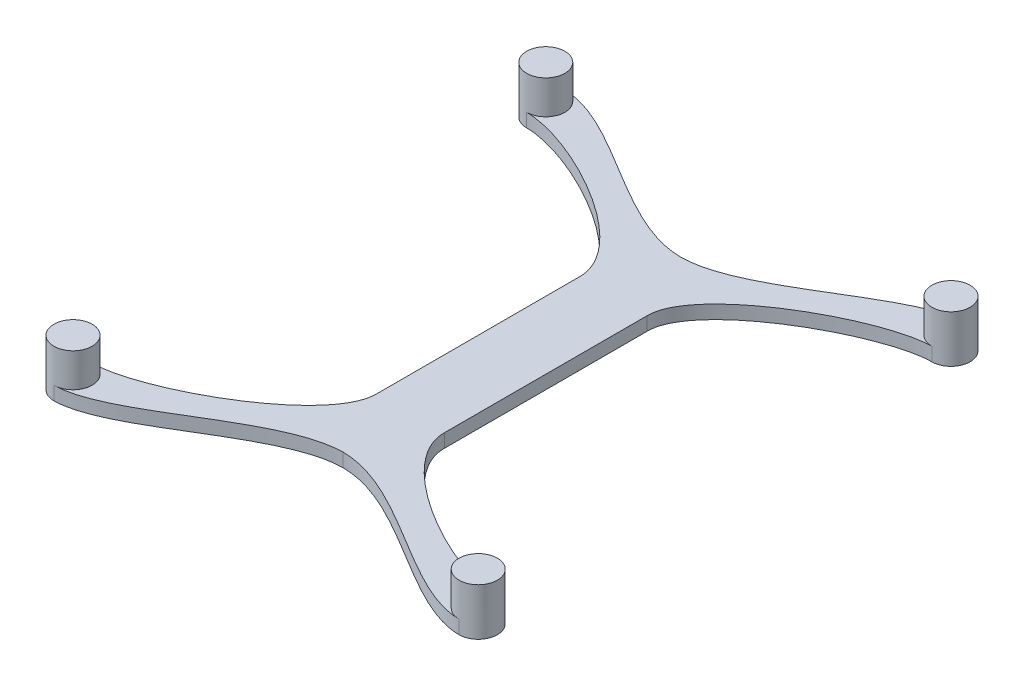
ISO-10303-21;
HEADER;
FILE_DESCRIPTION(('STEP AP214'),'2;1');
FILE_NAME('part.step','',(''),(''),'','','');
FILE_SCHEMA(('AUTOMOTIVE_DESIGN { 1 0 10303 214 1 1 1 1 }'));
ENDSEC;
DATA;
#1=APPLICATION_CONTEXT('core data for automotive mechanical design processes');
#2=APPLICATION_PROTOCOL_DEFINITION('international standard','automotive_design',2000,#1);
#3=PRODUCT_CONTEXT('',#1,'mechanical');
#4=PRODUCT('Part','Part','',(#3));
#5=PRODUCT_RELATED_PRODUCT_CATEGORY('part','',(#4));
#6=PRODUCT_DEFINITION_FORMATION('','',#4);
#7=PRODUCT_DEFINITION_CONTEXT('part definition',#1,'design');
#8=PRODUCT_DEFINITION('design','',#6,#7);
#9=PRODUCT_DEFINITION_SHAPE('','',#8);
#10=(LENGTH_UNIT() NAMED_UNIT(*) SI_UNIT(.MILLI.,.METRE.));
#11=(NAMED_UNIT(*) PLANE_ANGLE_UNIT() SI_UNIT($,.RADIAN.));
#12=(NAMED_UNIT(*) SI_UNIT($,.STERADIAN.) SOLID_ANGLE_UNIT());
#13=UNCERTAINTY_MEASURE_WITH_UNIT(LENGTH_MEASURE(1.E-05),#10,'distance_accuracy_value','');
#14=(GEOMETRIC_REPRESENTATION_CONTEXT(3) GLOBAL_UNCERTAINTY_ASSIGNED_CONTEXT((#13)) GLOBAL_UNIT_ASSIGNED_CONTEXT((#10,
#11,#12)) REPRESENTATION_CONTEXT('',''));
#15=CARTESIAN_POINT('',(0.,0.,0.));
#16=DIRECTION('',(0.,0.,1.));
#17=DIRECTION('',(1.,0.,0.));
#18=AXIS2_PLACEMENT_3D('',#15,#16,#17);
#19=CARTESIAN_POINT('',(0.,2.54,0.));
#20=DIRECTION('',(0.,1.,0.));
#21=DIRECTION('',(0.,0.,1.));
#22=AXIS2_PLACEMENT_3D('',#19,#20,#21);
#23=PLANE('',#22);
#24=CARTESIAN_POINT('',(0.,2.54,31.75));
#25=CARTESIAN_POINT('',(11.9435219789802,2.54,31.8273533169688));
#26=CARTESIAN_POINT('',(27.7064298825426,2.54,47.9601152899071));
#27=CARTESIAN_POINT('',(38.1,2.54,48.0441));
#28=B_SPLINE_CURVE_WITH_KNOTS('',3,(#24,#25,#26,#27),.UNSPECIFIED.,.F.,.F.,(4,4),(0.,1.),.UNSPECIFIED.);
#29=CARTESIAN_POINT('',(0.,2.54,31.75));
#30=VERTEX_POINT('',#29);
#31=CARTESIAN_POINT('',(38.0102091373793,2.54,48.0429782090864));
#32=VERTEX_POINT('',#31);
#33=EDGE_CURVE('E174',#30,#32,#28,.T.);
#34=ORIENTED_EDGE('',*,*,#33,.T.);
#35=CARTESIAN_POINT('',(38.1,2.54,44.45));
#36=DIRECTION('',(0.,1.,0.));
#37=DIRECTION('',(0.,0.,-1.));
#38=AXIS2_PLACEMENT_3D('',#35,#36,#37);
#39=CIRCLE('',#38,3.5941);
#40=CARTESIAN_POINT('',(38.1,2.54,40.8559));
#41=VERTEX_POINT('',#40);
#42=EDGE_CURVE('E181',#41,#32,#39,.T.);
#43=ORIENTED_EDGE('',*,*,#42,.F.);
#44=CARTESIAN_POINT('',(6.35,2.54,19.05));
#45=CARTESIAN_POINT('',(6.17525079711161,2.54,28.3940371659148));
#46=CARTESIAN_POINT('',(28.7527001791665,2.54,40.7931123845633));
#47=CARTESIAN_POINT('',(38.1,2.54,40.8559));
#48=B_SPLINE_CURVE_WITH_KNOTS('',3,(#44,#45,#46,#47),.UNSPECIFIED.,.F.,.F.,(4,4),(0.,1.),.UNSPECIFIED.);
#49=CARTESIAN_POINT('',(6.35,2.54,19.05));
#50=VERTEX_POINT('',#49);
#51=EDGE_CURVE('E163',#50,#41,#48,.T.);
#52=ORIENTED_EDGE('',*,*,#51,.F.);
#53=DIRECTION('',(0.,0.,-1.));
#54=VECTOR('',#53,1.);
#55=CARTESIAN_POINT('',(6.35,2.54,0.));
#56=LINE('',#55,#54);
#57=CARTESIAN_POINT('',(6.35,2.54,-19.05));
#58=VERTEX_POINT('',#57);
#59=EDGE_CURVE('E259',#50,#58,#56,.T.);
#60=ORIENTED_EDGE('',*,*,#59,.T.);
#61=CARTESIAN_POINT('',(6.35,2.54,-19.05));
#62=CARTESIAN_POINT('',(6.17525079711161,2.54,-28.3940371659148));
#63=CARTESIAN_POINT('',(28.7527001791665,2.54,-40.7931123845633));
#64=CARTESIAN_POINT('',(38.1,2.54,-40.8559));
#65=B_SPLINE_CURVE_WITH_KNOTS('',3,(#61,#62,#63,#64),.UNSPECIFIED.,.F.,.F.,(4,4),(0.,1.),.UNSPECIFIED.);
#66=CARTESIAN_POINT('',(38.1,2.54,-40.8559));
#67=VERTEX_POINT('',#66);
#68=EDGE_CURVE('E254',#58,#67,#65,.T.);
#69=ORIENTED_EDGE('',*,*,#68,.T.);
#70=CARTESIAN_POINT('',(38.1,2.54,-44.45));
#71=DIRECTION('',(0.,-1.,0.));
#72=DIRECTION('',(0.,0.,1.));
#73=AXIS2_PLACEMENT_3D('',#70,#71,#72);
#74=CIRCLE('',#73,3.5941);
#75=CARTESIAN_POINT('',(38.0102091373792,2.54,-48.0429782090892));
#76=VERTEX_POINT('',#75);
#77=EDGE_CURVE('E203',#67,#76,#74,.T.);
#78=ORIENTED_EDGE('',*,*,#77,.T.);
#79=CARTESIAN_POINT('',(0.,2.54,-31.75));
#80=CARTESIAN_POINT('',(11.9435219789802,2.54,-31.8273533169688));
#81=CARTESIAN_POINT('',(27.7064298825426,2.54,-47.9601152899071));
#82=CARTESIAN_POINT('',(38.1,2.54,-48.0441));
#83=B_SPLINE_CURVE_WITH_KNOTS('',3,(#79,#80,#81,#82),.UNSPECIFIED.,.F.,.F.,(4,4),(0.,1.),.UNSPECIFIED.);
#84=CARTESIAN_POINT('',(0.,2.54,-31.75));
#85=VERTEX_POINT('',#84);
#86=EDGE_CURVE('E266',#85,#76,#83,.T.);
#87=ORIENTED_EDGE('',*,*,#86,.F.);
#88=CARTESIAN_POINT('',(0.,2.54,-31.75));
#89=CARTESIAN_POINT('',(-11.9435219789802,2.54,-31.8273533169688));
#90=CARTESIAN_POINT('',(-27.7064298825426,2.54,-47.9601152899071));
#91=CARTESIAN_POINT('',(-38.1,2.54,-48.0441));
#92=B_SPLINE_CURVE_WITH_KNOTS('',3,(#88,#89,#90,#91),.UNSPECIFIED.,.F.,.F.,(4,4),(0.,1.),.UNSPECIFIED.);
#93=CARTESIAN_POINT('',(-38.0102091373793,2.54,-48.0429782090864));
#94=VERTEX_POINT('',#93);
#95=EDGE_CURVE('E402',#85,#94,#92,.T.);
#96=ORIENTED_EDGE('',*,*,#95,.T.);
#97=CARTESIAN_POINT('',(-38.1,2.54,-44.45));
#98=DIRECTION('',(0.,1.,0.));
#99=DIRECTION('',(0.,0.,1.));
#100=AXIS2_PLACEMENT_3D('',#97,#98,#99);
#101=CIRCLE('',#100,3.5941);
#102=CARTESIAN_POINT('',(-38.1,2.54,-40.8559));
#103=VERTEX_POINT('',#102);
#104=EDGE_CURVE('E371',#103,#94,#101,.T.);
#105=ORIENTED_EDGE('',*,*,#104,.F.);
#106=CARTESIAN_POINT('',(-6.35,2.54,-19.05));
#107=CARTESIAN_POINT('',(-6.17525079711161,2.54,-28.3940371659148));
#108=CARTESIAN_POINT('',(-28.7527001791665,2.54,-40.7931123845633));
#109=CARTESIAN_POINT('',(-38.1,2.54,-40.8559));
#110=B_SPLINE_CURVE_WITH_KNOTS('',3,(#106,#107,#108,#109),.UNSPECIFIED.,.F.,.F.,(4,4),(0.,1.),.UNSPECIFIED.);
#111=CARTESIAN_POINT('',(-6.35,2.54,-19.05));
#112=VERTEX_POINT('',#111);
#113=EDGE_CURVE('E394',#112,#103,#110,.T.);
#114=ORIENTED_EDGE('',*,*,#113,.F.);
#115=DIRECTION('',(0.,0.,-1.));
#116=VECTOR('',#115,1.);
#117=CARTESIAN_POINT('',(-6.35,2.54,0.));
#118=LINE('',#117,#116);
#119=CARTESIAN_POINT('',(-6.35,2.54,19.05));
#120=VERTEX_POINT('',#119);
#121=EDGE_CURVE('E397',#120,#112,#118,.T.);
#122=ORIENTED_EDGE('',*,*,#121,.F.);
#123=CARTESIAN_POINT('',(-6.35,2.54,19.05));
#124=CARTESIAN_POINT('',(-6.17525079711161,2.54,28.3940371659148));
#125=CARTESIAN_POINT('',(-28.7527001791665,2.54,40.7931123845633));
#126=CARTESIAN_POINT('',(-38.1,2.54,40.8559));
#127=B_SPLINE_CURVE_WITH_KNOTS('',3,(#123,#124,#125,#126),.UNSPECIFIED.,.F.,.F.,(4,4),(0.,1.),.UNSPECIFIED.);
#128=CARTESIAN_POINT('',(-38.1,2.54,40.8559));
#129=VERTEX_POINT('',#128);
#130=EDGE_CURVE('E348',#120,#129,#127,.T.);
#131=ORIENTED_EDGE('',*,*,#130,.T.);
#132=CARTESIAN_POINT('',(-38.1,2.54,44.45));
#133=DIRECTION('',(0.,-1.,0.));
#134=DIRECTION('',(0.,0.,-1.));
#135=AXIS2_PLACEMENT_3D('',#132,#133,#134);
#136=CIRCLE('',#135,3.5941);
#137=CARTESIAN_POINT('',(-38.0102091373792,2.54,48.0429782090892));
#138=VERTEX_POINT('',#137);
#139=EDGE_CURVE('E202',#129,#138,#136,.T.);
#140=ORIENTED_EDGE('',*,*,#139,.T.);
#141=CARTESIAN_POINT('',(0.,2.54,31.75));
#142=CARTESIAN_POINT('',(-11.9435219789802,2.54,31.8273533169688));
#143=CARTESIAN_POINT('',(-27.7064298825426,2.54,47.9601152899071));
#144=CARTESIAN_POINT('',(-38.1,2.54,48.0441));
#145=B_SPLINE_CURVE_WITH_KNOTS('',3,(#141,#142,#143,#144),.UNSPECIFIED.,.F.,.F.,(4,4),(0.,1.),.UNSPECIFIED.);
#146=EDGE_CURVE('E355',#30,#138,#145,.T.);
#147=ORIENTED_EDGE('',*,*,#146,.F.);
#148=EDGE_LOOP('',(#34,#43,#52,#60,#69,#78,#87,#96,#105,#114,#122,#131,#140,#147));
#149=FACE_BOUND('',#148,.T.);
#150=ADVANCED_FACE('F43',(#149),#23,.T.);
#151=DIRECTION('',(0.,-1.,0.));
#152=VECTOR('',#151,1.);
#153=SURFACE_OF_LINEAR_EXTRUSION('',#110,#152);
#154=CARTESIAN_POINT('',(-6.35,0.,-19.05));
#155=CARTESIAN_POINT('',(-6.17525079711161,0.,-28.3940371659148));
#156=CARTESIAN_POINT('',(-28.7527001791665,0.,-40.7931123845633));
#157=CARTESIAN_POINT('',(-38.1,0.,-40.8559));
#158=B_SPLINE_CURVE_WITH_KNOTS('',3,(#154,#155,#156,#157),.UNSPECIFIED.,.F.,.F.,(4,4),(0.,1.),.UNSPECIFIED.);
#159=CARTESIAN_POINT('',(-6.35,0.,-19.05));
#160=VERTEX_POINT('',#159);
#161=CARTESIAN_POINT('',(-38.1,0.,-40.8559));
#162=VERTEX_POINT('',#161);
#163=EDGE_CURVE('E379',#160,#162,#158,.T.);
#164=ORIENTED_EDGE('',*,*,#163,.F.);
#165=DIRECTION('',(0.,-1.,0.));
#166=VECTOR('',#165,1.);
#167=CARTESIAN_POINT('',(-6.35,2.54,-19.05));
#168=LINE('',#167,#166);
#169=EDGE_CURVE('E11',#112,#160,#168,.T.);
#170=ORIENTED_EDGE('',*,*,#169,.F.);
#171=ORIENTED_EDGE('',*,*,#113,.T.);
#172=DIRECTION('',(0.,-1.,0.));
#173=VECTOR('',#172,1.);
#174=CARTESIAN_POINT('',(-38.1,2.54,-40.8559));
#175=LINE('',#174,#173);
#176=EDGE_CURVE('E404',#103,#162,#175,.T.);
#177=ORIENTED_EDGE('',*,*,#176,.T.);
#178=EDGE_LOOP('',(#164,#170,#171,#177));
#179=FACE_BOUND('',#178,.T.);
#180=ADVANCED_FACE('F45',(#179),#153,.T.);
#181=CARTESIAN_POINT('',(-6.35,2.54,0.));
#182=DIRECTION('',(-1.,0.,0.));
#183=DIRECTION('',(0.,0.,1.));
#184=AXIS2_PLACEMENT_3D('',#181,#182,#183);
#185=PLANE('',#184);
#186=DIRECTION('',(0.,0.,-1.));
#187=VECTOR('',#186,1.);
#188=CARTESIAN_POINT('',(-6.35,0.,0.));
#189=LINE('',#188,#187);
#190=CARTESIAN_POINT('',(-6.35,0.,19.05));
#191=VERTEX_POINT('',#190);
#192=EDGE_CURVE('E383',#191,#160,#189,.T.);
#193=ORIENTED_EDGE('',*,*,#192,.F.);
#194=DIRECTION('',(0.,-1.,0.));
#195=VECTOR('',#194,1.);
#196=CARTESIAN_POINT('',(-6.35,2.54,19.05));
#197=LINE('',#196,#195);
#198=EDGE_CURVE('E358',#120,#191,#197,.T.);
#199=ORIENTED_EDGE('',*,*,#198,.F.);
#200=ORIENTED_EDGE('',*,*,#121,.T.);
#201=ORIENTED_EDGE('',*,*,#169,.T.);
#202=EDGE_LOOP('',(#193,#199,#200,#201));
#203=FACE_BOUND('',#202,.T.);
#204=ADVANCED_FACE('F531',(#203),#185,.T.);
#205=DIRECTION('',(0.,-1.,0.));
#206=VECTOR('',#205,1.);
#207=SURFACE_OF_LINEAR_EXTRUSION('',#92,#206);
#208=CARTESIAN_POINT('',(0.,0.,-31.75));
#209=CARTESIAN_POINT('',(-11.9435219789802,0.,-31.8273533169688));
#210=CARTESIAN_POINT('',(-27.7064298825426,0.,-47.9601152899071));
#211=CARTESIAN_POINT('',(-38.1,0.,-48.0441));
#212=B_SPLINE_CURVE_WITH_KNOTS('',3,(#208,#209,#210,#211),.UNSPECIFIED.,.F.,.F.,(4,4),(0.,1.),.UNSPECIFIED.);
#213=CARTESIAN_POINT('',(0.,0.,-31.75));
#214=VERTEX_POINT('',#213);
#215=CARTESIAN_POINT('',(-38.1,0.,-48.0441));
#216=VERTEX_POINT('',#215);
#217=EDGE_CURVE('E387',#214,#216,#212,.T.);
#218=ORIENTED_EDGE('',*,*,#217,.T.);
#219=DIRECTION('',(0.,-1.,0.));
#220=VECTOR('',#219,1.);
#221=CARTESIAN_POINT('',(-38.1,2.54,-48.0441));
#222=LINE('',#221,#220);
#223=CARTESIAN_POINT('',(-38.1,2.54,-48.0441));
#224=VERTEX_POINT('',#223);
#225=EDGE_CURVE('E407',#224,#216,#222,.T.);
#226=ORIENTED_EDGE('',*,*,#225,.F.);
#227=CARTESIAN_POINT('',(-38.1,2.54,-48.0441));
#228=CARTESIAN_POINT('',(-38.0701140337997,2.54,-48.0438585079834));
#229=CARTESIAN_POINT('',(-38.040183673441,2.54,-48.0434843232607));
#230=CARTESIAN_POINT('',(-38.0102091373793,2.54,-48.0429782090864));
#231=B_SPLINE_CURVE_WITH_KNOTS('',3,(#227,#228,#229,#230),.UNSPECIFIED.,.F.,.F.,(4,4),
(0.99712457164742,1.),.UNSPECIFIED.);
#232=EDGE_CURVE('E73',#94,#224,#231,.F.);
#233=ORIENTED_EDGE('',*,*,#232,.F.);
#234=ORIENTED_EDGE('',*,*,#95,.F.);
#235=DIRECTION('',(0.,-1.,0.));
#236=VECTOR('',#235,1.);
#237=CARTESIAN_POINT('',(0.,2.54,-31.75));
#238=LINE('',#237,#236);
#239=EDGE_CURVE('E56',#85,#214,#238,.T.);
#240=ORIENTED_EDGE('',*,*,#239,.T.);
#241=EDGE_LOOP('',(#218,#226,#233,#234,#240));
#242=FACE_BOUND('',#241,.T.);
#243=ADVANCED_FACE('F435',(#242),#207,.F.);
#244=CARTESIAN_POINT('',(-38.1,2.54,-44.45));
#245=DIRECTION('',(0.,-1.,0.));
#246=DIRECTION('',(0.,0.,-1.));
#247=AXIS2_PLACEMENT_3D('',#244,#245,#246);
#248=CYLINDRICAL_SURFACE('',#247,3.5941);
#249=CARTESIAN_POINT('',(-38.1,0.,-44.45));
#250=DIRECTION('',(0.,1.,0.));
#251=DIRECTION('',(0.,0.,1.));
#252=AXIS2_PLACEMENT_3D('',#249,#250,#251);
#253=CIRCLE('',#252,3.5941);
#254=EDGE_CURVE('E390',#216,#162,#253,.T.);
#255=ORIENTED_EDGE('',*,*,#254,.T.);
#256=ORIENTED_EDGE('',*,*,#176,.F.);
#257=ORIENTED_EDGE('',*,*,#104,.T.);
#258=ORIENTED_EDGE('',*,*,#232,.T.);
#259=ORIENTED_EDGE('',*,*,#225,.T.);
#260=EDGE_LOOP('',(#255,#256,#257,#258,#259));
#261=FACE_BOUND('',#260,.T.);
#262=CARTESIAN_POINT('',(-38.1,8.89,-44.45));
#263=DIRECTION('',(0.,1.,0.));
#264=DIRECTION('',(0.,0.,1.));
#265=AXIS2_PLACEMENT_3D('',#262,#263,#264);
#266=CIRCLE('',#265,3.5941);
#267=CARTESIAN_POINT('',(-38.1,8.89,-40.8559));
#268=VERTEX_POINT('',#267);
#269=EDGE_CURVE('E375',#268,#268,#266,.T.);
#270=ORIENTED_EDGE('',*,*,#269,.F.);
#271=EDGE_LOOP('',(#270));
#272=FACE_BOUND('',#271,.T.);
#273=ADVANCED_FACE('F449',(#261,#272),#248,.T.);
#274=CARTESIAN_POINT('',(0.,0.,0.));
#275=DIRECTION('',(0.,1.,0.));
#276=DIRECTION('',(0.,0.,1.));
#277=AXIS2_PLACEMENT_3D('',#274,#275,#276);
#278=PLANE('',#277);
#279=ORIENTED_EDGE('',*,*,#163,.T.);
#280=ORIENTED_EDGE('',*,*,#254,.F.);
#281=ORIENTED_EDGE('',*,*,#217,.F.);
#282=CARTESIAN_POINT('',(0.,0.,-31.75));
#283=CARTESIAN_POINT('',(11.9435219789802,0.,-31.8273533169688));
#284=CARTESIAN_POINT('',(27.7064298825426,0.,-47.9601152899071));
#285=CARTESIAN_POINT('',(38.1,0.,-48.0441));
#286=B_SPLINE_CURVE_WITH_KNOTS('',3,(#282,#283,#284,#285),.UNSPECIFIED.,.F.,.F.,(4,4),(0.,1.),.UNSPECIFIED.);
#287=CARTESIAN_POINT('',(38.1,0.,-48.0441));
#288=VERTEX_POINT('',#287);
#289=EDGE_CURVE('E320',#214,#288,#286,.T.);
#290=ORIENTED_EDGE('',*,*,#289,.T.);
#291=CARTESIAN_POINT('',(38.1,0.,-44.45));
#292=DIRECTION('',(0.,-1.,0.));
#293=DIRECTION('',(0.,0.,1.));
#294=AXIS2_PLACEMENT_3D('',#291,#292,#293);
#295=CIRCLE('',#294,3.5941);
#296=CARTESIAN_POINT('',(38.1,0.,-40.8559));
#297=VERTEX_POINT('',#296);
#298=EDGE_CURVE('E317',#288,#297,#295,.T.);
#299=ORIENTED_EDGE('',*,*,#298,.T.);
#300=CARTESIAN_POINT('',(6.35,0.,-19.05));
#301=CARTESIAN_POINT('',(6.17525079711161,0.,-28.3940371659148));
#302=CARTESIAN_POINT('',(28.7527001791665,0.,-40.7931123845633));
#303=CARTESIAN_POINT('',(38.1,0.,-40.8559));
#304=B_SPLINE_CURVE_WITH_KNOTS('',3,(#300,#301,#302,#303),.UNSPECIFIED.,.F.,.F.,(4,4),(0.,1.),.UNSPECIFIED.);
#305=CARTESIAN_POINT('',(6.35,0.,-19.05));
#306=VERTEX_POINT('',#305);
#307=EDGE_CURVE('E314',#306,#297,#304,.T.);
#308=ORIENTED_EDGE('',*,*,#307,.F.);
#309=DIRECTION('',(0.,0.,-1.));
#310=VECTOR('',#309,1.);
#311=CARTESIAN_POINT('',(6.35,0.,0.));
#312=LINE('',#311,#310);
#313=CARTESIAN_POINT('',(6.35,0.,19.05));
#314=VERTEX_POINT('',#313);
#315=EDGE_CURVE('E324',#314,#306,#312,.T.);
#316=ORIENTED_EDGE('',*,*,#315,.F.);
#317=CARTESIAN_POINT('',(6.35,0.,19.05));
#318=CARTESIAN_POINT('',(6.17525079711161,0.,28.3940371659148));
#319=CARTESIAN_POINT('',(28.7527001791665,0.,40.7931123845633));
#320=CARTESIAN_POINT('',(38.1,0.,40.8559));
#321=B_SPLINE_CURVE_WITH_KNOTS('',3,(#317,#318,#319,#320),.UNSPECIFIED.,.F.,.F.,(4,4),(0.,1.),.UNSPECIFIED.);
#322=CARTESIAN_POINT('',(38.1,0.,40.8559));
#323=VERTEX_POINT('',#322);
#324=EDGE_CURVE('E213',#314,#323,#321,.T.);
#325=ORIENTED_EDGE('',*,*,#324,.T.);
#326=CARTESIAN_POINT('',(38.1,0.,44.45));
#327=DIRECTION('',(0.,1.,0.));
#328=DIRECTION('',(0.,0.,-1.));
#329=AXIS2_PLACEMENT_3D('',#326,#327,#328);
#330=CIRCLE('',#329,3.5941);
#331=CARTESIAN_POINT('',(38.1,0.,48.0441));
#332=VERTEX_POINT('',#331);
#333=EDGE_CURVE('E175',#332,#323,#330,.T.);
#334=ORIENTED_EDGE('',*,*,#333,.F.);
#335=CARTESIAN_POINT('',(0.,0.,31.75));
#336=CARTESIAN_POINT('',(11.9435219789802,0.,31.8273533169688));
#337=CARTESIAN_POINT('',(27.7064298825426,0.,47.9601152899071));
#338=CARTESIAN_POINT('',(38.1,0.,48.0441));
#339=B_SPLINE_CURVE_WITH_KNOTS('',3,(#335,#336,#337,#338),.UNSPECIFIED.,.F.,.F.,(4,4),(0.,1.),.UNSPECIFIED.);
#340=CARTESIAN_POINT('',(0.,0.,31.75));
#341=VERTEX_POINT('',#340);
#342=EDGE_CURVE('E308',#341,#332,#339,.T.);
#343=ORIENTED_EDGE('',*,*,#342,.F.);
#344=CARTESIAN_POINT('',(0.,0.,31.75));
#345=CARTESIAN_POINT('',(-11.9435219789802,0.,31.8273533169688));
#346=CARTESIAN_POINT('',(-27.7064298825426,0.,47.9601152899071));
#347=CARTESIAN_POINT('',(-38.1,0.,48.0441));
#348=B_SPLINE_CURVE_WITH_KNOTS('',3,(#344,#345,#346,#347),.UNSPECIFIED.,.F.,.F.,(4,4),(0.,1.),.UNSPECIFIED.);
#349=CARTESIAN_POINT('',(-38.1,0.,48.0441));
#350=VERTEX_POINT('',#349);
#351=EDGE_CURVE('E344',#341,#350,#348,.T.);
#352=ORIENTED_EDGE('',*,*,#351,.T.);
#353=CARTESIAN_POINT('',(-38.1,0.,44.45));
#354=DIRECTION('',(0.,-1.,0.));
#355=DIRECTION('',(0.,0.,-1.));
#356=AXIS2_PLACEMENT_3D('',#353,#354,#355);
#357=CIRCLE('',#356,3.5941);
#358=CARTESIAN_POINT('',(-38.1,0.,40.8559));
#359=VERTEX_POINT('',#358);
#360=EDGE_CURVE('E340',#350,#359,#357,.T.);
#361=ORIENTED_EDGE('',*,*,#360,.T.);
#362=CARTESIAN_POINT('',(-6.35,0.,19.05));
#363=CARTESIAN_POINT('',(-6.17525079711161,0.,28.3940371659148));
#364=CARTESIAN_POINT('',(-28.7527001791665,0.,40.7931123845633));
#365=CARTESIAN_POINT('',(-38.1,0.,40.8559));
#366=B_SPLINE_CURVE_WITH_KNOTS('',3,(#362,#363,#364,#365),.UNSPECIFIED.,.F.,.F.,(4,4),(0.,1.),.UNSPECIFIED.);
#367=EDGE_CURVE('E336',#191,#359,#366,.T.);
#368=ORIENTED_EDGE('',*,*,#367,.F.);
#369=ORIENTED_EDGE('',*,*,#192,.T.);
#370=EDGE_LOOP('',(#279,#280,#281,#290,#299,#308,#316,#325,#334,#343,#352,#361,#368,#369));
#371=FACE_BOUND('',#370,.T.);
#372=ADVANCED_FACE('F458',(#371),#278,.F.);
#373=CARTESIAN_POINT('',(-38.1,8.89,-44.45));
#374=DIRECTION('',(0.,1.,0.));
#375=DIRECTION('',(0.,0.,1.));
#376=AXIS2_PLACEMENT_3D('',#373,#374,#375);
#377=PLANE('',#376);
#378=ORIENTED_EDGE('',*,*,#269,.T.);
#379=EDGE_LOOP('',(#378));
#380=FACE_BOUND('',#379,.T.);
#381=ADVANCED_FACE('F461',(#380),#377,.T.);
#382=DIRECTION('',(0.,-1.,0.));
#383=VECTOR('',#382,1.);
#384=SURFACE_OF_LINEAR_EXTRUSION('',#127,#383);
#385=ORIENTED_EDGE('',*,*,#367,.T.);
#386=DIRECTION('',(0.,-1.,0.));
#387=VECTOR('',#386,1.);
#388=CARTESIAN_POINT('',(-38.1,2.54,40.8559));
#389=LINE('',#388,#387);
#390=EDGE_CURVE('E368',#129,#359,#389,.T.);
#391=ORIENTED_EDGE('',*,*,#390,.F.);
#392=ORIENTED_EDGE('',*,*,#130,.F.);
#393=ORIENTED_EDGE('',*,*,#198,.T.);
#394=EDGE_LOOP('',(#385,#391,#392,#393));
#395=FACE_BOUND('',#394,.T.);
#396=ADVANCED_FACE('F467',(#395),#384,.F.);
#397=CARTESIAN_POINT('',(-38.1,2.54,44.45));
#398=DIRECTION('',(0.,-1.,0.));
#399=DIRECTION('',(0.,0.,-1.));
#400=AXIS2_PLACEMENT_3D('',#397,#398,#399);
#401=CYLINDRICAL_SURFACE('',#400,3.5941);
#402=ORIENTED_EDGE('',*,*,#360,.F.);
#403=DIRECTION('',(0.,-1.,0.));
#404=VECTOR('',#403,1.);
#405=CARTESIAN_POINT('',(-38.1,2.54,48.0441));
#406=LINE('',#405,#404);
#407=CARTESIAN_POINT('',(-38.1,2.54,48.0441));
#408=VERTEX_POINT('',#407);
#409=EDGE_CURVE('E365',#408,#350,#406,.T.);
#410=ORIENTED_EDGE('',*,*,#409,.F.);
#411=CARTESIAN_POINT('',(-38.0102091373793,2.54,48.0429782090864));
#412=CARTESIAN_POINT('',(-38.040183673441,2.54,48.0434843232607));
#413=CARTESIAN_POINT('',(-38.0701140337997,2.54,48.0438585079834));
#414=CARTESIAN_POINT('',(-38.1,2.54,48.0441));
#415=B_SPLINE_CURVE_WITH_KNOTS('',3,(#411,#412,#413,#414),.UNSPECIFIED.,.F.,.F.,(4,4),
(0.99712457164742,1.),.UNSPECIFIED.);
#416=EDGE_CURVE('E352',#138,#408,#415,.T.);
#417=ORIENTED_EDGE('',*,*,#416,.F.);
#418=ORIENTED_EDGE('',*,*,#139,.F.);
#419=ORIENTED_EDGE('',*,*,#390,.T.);
#420=EDGE_LOOP('',(#402,#410,#417,#418,#419));
#421=FACE_BOUND('',#420,.T.);
#422=CARTESIAN_POINT('',(-38.1,8.89,44.45));
#423=DIRECTION('',(0.,-1.,0.));
#424=DIRECTION('',(0.,0.,-1.));
#425=AXIS2_PLACEMENT_3D('',#422,#423,#424);
#426=CIRCLE('',#425,3.5941);
#427=CARTESIAN_POINT('',(-38.1,8.89,40.8559));
#428=VERTEX_POINT('',#427);
#429=EDGE_CURVE('E209',#428,#428,#426,.T.);
#430=ORIENTED_EDGE('',*,*,#429,.T.);
#431=EDGE_LOOP('',(#430));
#432=FACE_BOUND('',#431,.T.);
#433=ADVANCED_FACE('F471',(#421,#432),#401,.T.);
#434=DIRECTION('',(0.,-1.,0.));
#435=VECTOR('',#434,1.);
#436=SURFACE_OF_LINEAR_EXTRUSION('',#145,#435);
#437=ORIENTED_EDGE('',*,*,#351,.F.);
#438=DIRECTION('',(0.,-1.,0.));
#439=VECTOR('',#438,1.);
#440=CARTESIAN_POINT('',(0.,2.54,31.75));
#441=LINE('',#440,#439);
#442=EDGE_CURVE('E362',#30,#341,#441,.T.);
#443=ORIENTED_EDGE('',*,*,#442,.F.);
#444=ORIENTED_EDGE('',*,*,#146,.T.);
#445=ORIENTED_EDGE('',*,*,#416,.T.);
#446=ORIENTED_EDGE('',*,*,#409,.T.);
#447=EDGE_LOOP('',(#437,#443,#444,#445,#446));
#448=FACE_BOUND('',#447,.T.);
#449=ADVANCED_FACE('F491',(#448),#436,.T.);
#450=DIRECTION('',(0.,-1.,0.));
#451=VECTOR('',#450,1.);
#452=SURFACE_OF_LINEAR_EXTRUSION('',#65,#451);
#453=ORIENTED_EDGE('',*,*,#307,.T.);
#454=DIRECTION('',(0.,-1.,0.));
#455=VECTOR('',#454,1.);
#456=CARTESIAN_POINT('',(38.1,2.54,-40.8559));
#457=LINE('',#456,#455);
#458=EDGE_CURVE('E277',#67,#297,#457,.T.);
#459=ORIENTED_EDGE('',*,*,#458,.F.);
#460=ORIENTED_EDGE('',*,*,#68,.F.);
#461=DIRECTION('',(0.,-1.,0.));
#462=VECTOR('',#461,1.);
#463=CARTESIAN_POINT('',(6.35,2.54,-19.05));
#464=LINE('',#463,#462);
#465=EDGE_CURVE('E278',#58,#306,#464,.T.);
#466=ORIENTED_EDGE('',*,*,#465,.T.);
#467=EDGE_LOOP('',(#453,#459,#460,#466));
#468=FACE_BOUND('',#467,.T.);
#469=ADVANCED_FACE('F519',(#468),#452,.F.);
#470=CARTESIAN_POINT('',(38.1,2.54,-44.45));
#471=DIRECTION('',(0.,-1.,0.));
#472=DIRECTION('',(0.,0.,-1.));
#473=AXIS2_PLACEMENT_3D('',#470,#471,#472);
#474=CYLINDRICAL_SURFACE('',#473,3.5941);
#475=ORIENTED_EDGE('',*,*,#298,.F.);
#476=DIRECTION('',(0.,-1.,0.));
#477=VECTOR('',#476,1.);
#478=CARTESIAN_POINT('',(38.1,2.54,-48.0441));
#479=LINE('',#478,#477);
#480=CARTESIAN_POINT('',(38.1,2.54,-48.0441));
#481=VERTEX_POINT('',#480);
#482=EDGE_CURVE('E274',#481,#288,#479,.T.);
#483=ORIENTED_EDGE('',*,*,#482,.F.);
#484=CARTESIAN_POINT('',(38.0102091373793,2.54,-48.0429782090864));
#485=CARTESIAN_POINT('',(38.040183673441,2.54,-48.0434843232607));
#486=CARTESIAN_POINT('',(38.0701140337997,2.54,-48.0438585079834));
#487=CARTESIAN_POINT('',(38.1,2.54,-48.0441));
#488=B_SPLINE_CURVE_WITH_KNOTS('',3,(#484,#485,#486,#487),.UNSPECIFIED.,.F.,.F.,(4,4),
(0.99712457164742,1.),.UNSPECIFIED.);
#489=EDGE_CURVE('E270',#76,#481,#488,.T.);
#490=ORIENTED_EDGE('',*,*,#489,.F.);
#491=ORIENTED_EDGE('',*,*,#77,.F.);
#492=ORIENTED_EDGE('',*,*,#458,.T.);
#493=EDGE_LOOP('',(#475,#483,#490,#491,#492));
#494=FACE_BOUND('',#493,.T.);
#495=CARTESIAN_POINT('',(38.1,8.89,-44.45));
#496=DIRECTION('',(0.,-1.,0.));
#497=DIRECTION('',(0.,0.,1.));
#498=AXIS2_PLACEMENT_3D('',#495,#496,#497);
#499=CIRCLE('',#498,3.5941);
#500=CARTESIAN_POINT('',(38.1,8.89,-40.8559));
#501=VERTEX_POINT('',#500);
#502=EDGE_CURVE('E198',#501,#501,#499,.T.);
#503=ORIENTED_EDGE('',*,*,#502,.T.);
#504=EDGE_LOOP('',(#503));
#505=FACE_BOUND('',#504,.T.);
#506=ADVANCED_FACE('F244',(#494,#505),#474,.T.);
#507=DIRECTION('',(0.,-1.,0.));
#508=VECTOR('',#507,1.);
#509=SURFACE_OF_LINEAR_EXTRUSION('',#83,#508);
#510=ORIENTED_EDGE('',*,*,#289,.F.);
#511=ORIENTED_EDGE('',*,*,#239,.F.);
#512=ORIENTED_EDGE('',*,*,#86,.T.);
#513=ORIENTED_EDGE('',*,*,#489,.T.);
#514=ORIENTED_EDGE('',*,*,#482,.T.);
#515=EDGE_LOOP('',(#510,#511,#512,#513,#514));
#516=FACE_BOUND('',#515,.T.);
#517=ADVANCED_FACE('F238',(#516),#509,.T.);
#518=CARTESIAN_POINT('',(6.35,2.54,0.));
#519=DIRECTION('',(-1.,0.,0.));
#520=DIRECTION('',(0.,0.,1.));
#521=AXIS2_PLACEMENT_3D('',#518,#519,#520);
#522=PLANE('',#521);
#523=ORIENTED_EDGE('',*,*,#315,.T.);
#524=ORIENTED_EDGE('',*,*,#465,.F.);
#525=ORIENTED_EDGE('',*,*,#59,.F.);
#526=DIRECTION('',(0.,-1.,0.));
#527=VECTOR('',#526,1.);
#528=CARTESIAN_POINT('',(6.35,2.54,19.05));
#529=LINE('',#528,#527);
#530=EDGE_CURVE('E170',#50,#314,#529,.T.);
#531=ORIENTED_EDGE('',*,*,#530,.T.);
#532=EDGE_LOOP('',(#523,#524,#525,#531));
#533=FACE_BOUND('',#532,.T.);
#534=ADVANCED_FACE('F234',(#533),#522,.F.);
#535=DIRECTION('',(0.,-1.,0.));
#536=VECTOR('',#535,1.);
#537=SURFACE_OF_LINEAR_EXTRUSION('',#48,#536);
#538=ORIENTED_EDGE('',*,*,#324,.F.);
#539=ORIENTED_EDGE('',*,*,#530,.F.);
#540=ORIENTED_EDGE('',*,*,#51,.T.);
#541=DIRECTION('',(0.,-1.,0.));
#542=VECTOR('',#541,1.);
#543=CARTESIAN_POINT('',(38.1,2.54,40.8559));
#544=LINE('',#543,#542);
#545=EDGE_CURVE('E167',#41,#323,#544,.T.);
#546=ORIENTED_EDGE('',*,*,#545,.T.);
#547=EDGE_LOOP('',(#538,#539,#540,#546));
#548=FACE_BOUND('',#547,.T.);
#549=ADVANCED_FACE('F166',(#548),#537,.T.);
#550=DIRECTION('',(0.,-1.,0.));
#551=VECTOR('',#550,1.);
#552=SURFACE_OF_LINEAR_EXTRUSION('',#28,#551);
#553=ORIENTED_EDGE('',*,*,#342,.T.);
#554=DIRECTION('',(0.,-1.,0.));
#555=VECTOR('',#554,1.);
#556=CARTESIAN_POINT('',(38.1,2.54,48.0441));
#557=LINE('',#556,#555);
#558=CARTESIAN_POINT('',(38.1,2.54,48.0441));
#559=VERTEX_POINT('',#558);
#560=EDGE_CURVE('E186',#559,#332,#557,.T.);
#561=ORIENTED_EDGE('',*,*,#560,.F.);
#562=CARTESIAN_POINT('',(38.1,2.54,48.0441));
#563=CARTESIAN_POINT('',(38.0701140337997,2.54,48.0438585079834));
#564=CARTESIAN_POINT('',(38.040183673441,2.54,48.0434843232607));
#565=CARTESIAN_POINT('',(38.0102091373793,2.54,48.0429782090864));
#566=B_SPLINE_CURVE_WITH_KNOTS('',3,(#562,#563,#564,#565),.UNSPECIFIED.,.F.,.F.,(4,4),
(0.99712457164742,1.),.UNSPECIFIED.);
#567=EDGE_CURVE('E64',#32,#559,#566,.F.);
#568=ORIENTED_EDGE('',*,*,#567,.F.);
#569=ORIENTED_EDGE('',*,*,#33,.F.);
#570=ORIENTED_EDGE('',*,*,#442,.T.);
#571=EDGE_LOOP('',(#553,#561,#568,#569,#570));
#572=FACE_BOUND('',#571,.T.);
#573=ADVANCED_FACE('F233',(#572),#552,.F.);
#574=CARTESIAN_POINT('',(38.1,2.54,44.45));
#575=DIRECTION('',(0.,-1.,0.));
#576=DIRECTION('',(0.,0.,-1.));
#577=AXIS2_PLACEMENT_3D('',#574,#575,#576);
#578=CYLINDRICAL_SURFACE('',#577,3.5941);
#579=ORIENTED_EDGE('',*,*,#333,.T.);
#580=ORIENTED_EDGE('',*,*,#545,.F.);
#581=ORIENTED_EDGE('',*,*,#42,.T.);
#582=ORIENTED_EDGE('',*,*,#567,.T.);
#583=ORIENTED_EDGE('',*,*,#560,.T.);
#584=EDGE_LOOP('',(#579,#580,#581,#582,#583));
#585=FACE_BOUND('',#584,.T.);
#586=CARTESIAN_POINT('',(38.1,8.89,44.45));
#587=DIRECTION('',(0.,1.,0.));
#588=DIRECTION('',(0.,0.,-1.));
#589=AXIS2_PLACEMENT_3D('',#586,#587,#588);
#590=CIRCLE('',#589,3.5941);
#591=CARTESIAN_POINT('',(38.1,8.89,40.8559));
#592=VERTEX_POINT('',#591);
#593=EDGE_CURVE('E190',#592,#592,#590,.T.);
#594=ORIENTED_EDGE('',*,*,#593,.F.);
#595=EDGE_LOOP('',(#594));
#596=FACE_BOUND('',#595,.T.);
#597=ADVANCED_FACE('F179',(#585,#596),#578,.T.);
#598=CARTESIAN_POINT('',(-38.1,8.89,44.45));
#599=DIRECTION('',(0.,1.,0.));
#600=DIRECTION('',(0.,0.,-1.));
#601=AXIS2_PLACEMENT_3D('',#598,#599,#600);
#602=PLANE('',#601);
#603=ORIENTED_EDGE('',*,*,#429,.F.);
#604=EDGE_LOOP('',(#603));
#605=FACE_BOUND('',#604,.T.);
#606=ADVANCED_FACE('F653',(#605),#602,.T.);
#607=CARTESIAN_POINT('',(38.1,8.89,-44.45));
#608=DIRECTION('',(0.,1.,0.));
#609=DIRECTION('',(0.,0.,1.));
#610=AXIS2_PLACEMENT_3D('',#607,#608,#609);
#611=PLANE('',#610);
#612=ORIENTED_EDGE('',*,*,#502,.F.);
#613=EDGE_LOOP('',(#612));
#614=FACE_BOUND('',#613,.T.);
#615=ADVANCED_FACE('F661',(#614),#611,.T.);
#616=CARTESIAN_POINT('',(38.1,8.89,44.45));
#617=DIRECTION('',(0.,1.,0.));
#618=DIRECTION('',(0.,0.,-1.));
#619=AXIS2_PLACEMENT_3D('',#616,#617,#618);
#620=PLANE('',#619);
#621=ORIENTED_EDGE('',*,*,#593,.T.);
#622=EDGE_LOOP('',(#621));
#623=FACE_BOUND('',#622,.T.);
#624=ADVANCED_FACE('F671',(#623),#620,.T.);
#625=CLOSED_SHELL('',(#150,#180,#204,#243,#273,#372,#381,#396,#433,#449,#469,#506,#517,#534,
#549,#573,#597,#606,#615,#624));
#626=MANIFOLD_SOLID_BREP('B2',#625);
#627=ADVANCED_BREP_SHAPE_REPRESENTATION('',(#18,#626),#14);
#628=SHAPE_DEFINITION_REPRESENTATION(#9,#627);
ENDSEC;
END-ISO-10303-21;
